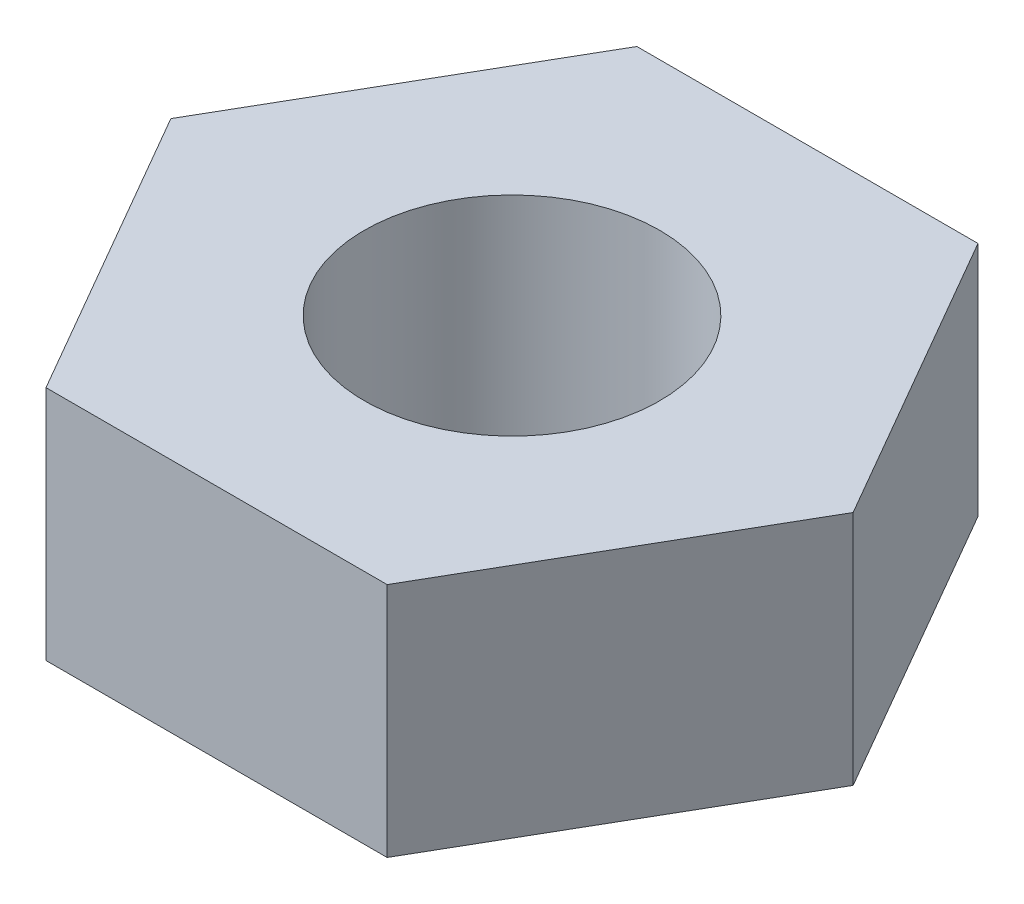
ISO-10303-21;
HEADER;
FILE_DESCRIPTION(('STEP AP214'),'2;1');
FILE_NAME('part.step','',(''),(''),'','','');
FILE_SCHEMA(('AUTOMOTIVE_DESIGN { 1 0 10303 214 1 1 1 1 }'));
ENDSEC;
DATA;
#1=APPLICATION_CONTEXT('core data for automotive mechanical design processes');
#2=APPLICATION_PROTOCOL_DEFINITION('international standard','automotive_design',2000,#1);
#3=PRODUCT_CONTEXT('',#1,'mechanical');
#4=PRODUCT('Part','Part','',(#3));
#5=PRODUCT_RELATED_PRODUCT_CATEGORY('part','',(#4));
#6=PRODUCT_DEFINITION_FORMATION('','',#4);
#7=PRODUCT_DEFINITION_CONTEXT('part definition',#1,'design');
#8=PRODUCT_DEFINITION('design','',#6,#7);
#9=PRODUCT_DEFINITION_SHAPE('','',#8);
#10=(LENGTH_UNIT() NAMED_UNIT(*) SI_UNIT(.MILLI.,.METRE.));
#11=(NAMED_UNIT(*) PLANE_ANGLE_UNIT() SI_UNIT($,.RADIAN.));
#12=(NAMED_UNIT(*) SI_UNIT($,.STERADIAN.) SOLID_ANGLE_UNIT());
#13=UNCERTAINTY_MEASURE_WITH_UNIT(LENGTH_MEASURE(1.E-05),#10,'distance_accuracy_value','');
#14=(GEOMETRIC_REPRESENTATION_CONTEXT(3) GLOBAL_UNCERTAINTY_ASSIGNED_CONTEXT((#13)) GLOBAL_UNIT_ASSIGNED_CONTEXT((#10,
#11,#12)) REPRESENTATION_CONTEXT('',''));
#15=CARTESIAN_POINT('',(0.,0.,0.));
#16=DIRECTION('',(0.,0.,1.));
#17=DIRECTION('',(1.,0.,0.));
#18=AXIS2_PLACEMENT_3D('',#15,#16,#17);
#19=CARTESIAN_POINT('',(1.15470053837925,1.6,2.));
#20=DIRECTION('',(-0.866025403784439,0.,-0.5));
#21=DIRECTION('',(-0.5,0.,0.866025403784439));
#22=AXIS2_PLACEMENT_3D('',#19,#20,#21);
#23=PLANE('',#22);
#24=DIRECTION('',(0.5,0.,-0.866025403784439));
#25=VECTOR('',#24,1.);
#26=CARTESIAN_POINT('',(1.15470053837925,0.,2.));
#27=LINE('',#26,#25);
#28=CARTESIAN_POINT('',(1.15470053837925,0.,2.));
#29=VERTEX_POINT('',#28);
#30=CARTESIAN_POINT('',(2.3094010767585,0.,0.));
#31=VERTEX_POINT('',#30);
#32=EDGE_CURVE('E125',#29,#31,#27,.T.);
#33=ORIENTED_EDGE('',*,*,#32,.T.);
#34=DIRECTION('',(0.,-1.,0.));
#35=VECTOR('',#34,1.);
#36=CARTESIAN_POINT('',(2.3094010767585,1.6,0.));
#37=LINE('',#36,#35);
#38=CARTESIAN_POINT('',(2.3094010767585,1.6,0.));
#39=VERTEX_POINT('',#38);
#40=EDGE_CURVE('E11',#39,#31,#37,.T.);
#41=ORIENTED_EDGE('',*,*,#40,.F.);
#42=DIRECTION('',(0.5,0.,-0.866025403784439));
#43=VECTOR('',#42,1.);
#44=CARTESIAN_POINT('',(1.15470053837925,1.6,2.));
#45=LINE('',#44,#43);
#46=CARTESIAN_POINT('',(1.15470053837925,1.6,2.));
#47=VERTEX_POINT('',#46);
#48=EDGE_CURVE('E136',#47,#39,#45,.T.);
#49=ORIENTED_EDGE('',*,*,#48,.F.);
#50=DIRECTION('',(0.,-1.,0.));
#51=VECTOR('',#50,1.);
#52=CARTESIAN_POINT('',(1.15470053837925,1.6,2.));
#53=LINE('',#52,#51);
#54=EDGE_CURVE('E121',#47,#29,#53,.T.);
#55=ORIENTED_EDGE('',*,*,#54,.T.);
#56=EDGE_LOOP('',(#33,#41,#49,#55));
#57=FACE_BOUND('',#56,.T.);
#58=ADVANCED_FACE('F41',(#57),#23,.F.);
#59=CARTESIAN_POINT('',(2.3094010767585,1.6,0.));
#60=DIRECTION('',(-0.866025403784438,0.,0.5));
#61=DIRECTION('',(0.5,0.,0.866025403784439));
#62=AXIS2_PLACEMENT_3D('',#59,#60,#61);
#63=PLANE('',#62);
#64=DIRECTION('',(-0.5,0.,-0.866025403784438));
#65=VECTOR('',#64,1.);
#66=CARTESIAN_POINT('',(2.3094010767585,0.,0.));
#67=LINE('',#66,#65);
#68=CARTESIAN_POINT('',(1.15470053837925,0.,-2.));
#69=VERTEX_POINT('',#68);
#70=EDGE_CURVE('E128',#31,#69,#67,.T.);
#71=ORIENTED_EDGE('',*,*,#70,.T.);
#72=DIRECTION('',(0.,-1.,0.));
#73=VECTOR('',#72,1.);
#74=CARTESIAN_POINT('',(1.15470053837925,1.6,-2.));
#75=LINE('',#74,#73);
#76=CARTESIAN_POINT('',(1.15470053837925,1.6,-2.));
#77=VERTEX_POINT('',#76);
#78=EDGE_CURVE('E49',#77,#69,#75,.T.);
#79=ORIENTED_EDGE('',*,*,#78,.F.);
#80=DIRECTION('',(-0.5,0.,-0.866025403784438));
#81=VECTOR('',#80,1.);
#82=CARTESIAN_POINT('',(2.3094010767585,1.6,0.));
#83=LINE('',#82,#81);
#84=EDGE_CURVE('E94',#39,#77,#83,.T.);
#85=ORIENTED_EDGE('',*,*,#84,.F.);
#86=ORIENTED_EDGE('',*,*,#40,.T.);
#87=EDGE_LOOP('',(#71,#79,#85,#86));
#88=FACE_BOUND('',#87,.T.);
#89=ADVANCED_FACE('F161',(#88),#63,.F.);
#90=CARTESIAN_POINT('',(1.15470053837925,1.6,-2.));
#91=DIRECTION('',(0.,0.,1.));
#92=DIRECTION('',(1.,0.,0.));
#93=AXIS2_PLACEMENT_3D('',#90,#91,#92);
#94=PLANE('',#93);
#95=DIRECTION('',(-1.,0.,0.));
#96=VECTOR('',#95,1.);
#97=CARTESIAN_POINT('',(1.15470053837925,0.,-2.));
#98=LINE('',#97,#96);
#99=CARTESIAN_POINT('',(-1.15470053837925,0.,-2.));
#100=VERTEX_POINT('',#99);
#101=EDGE_CURVE('E131',#69,#100,#98,.T.);
#102=ORIENTED_EDGE('',*,*,#101,.T.);
#103=DIRECTION('',(0.,-1.,0.));
#104=VECTOR('',#103,1.);
#105=CARTESIAN_POINT('',(-1.15470053837925,1.6,-2.));
#106=LINE('',#105,#104);
#107=CARTESIAN_POINT('',(-1.15470053837925,1.6,-2.));
#108=VERTEX_POINT('',#107);
#109=EDGE_CURVE('E116',#108,#100,#106,.T.);
#110=ORIENTED_EDGE('',*,*,#109,.F.);
#111=DIRECTION('',(-1.,0.,0.));
#112=VECTOR('',#111,1.);
#113=CARTESIAN_POINT('',(1.15470053837925,1.6,-2.));
#114=LINE('',#113,#112);
#115=EDGE_CURVE('E107',#77,#108,#114,.T.);
#116=ORIENTED_EDGE('',*,*,#115,.F.);
#117=ORIENTED_EDGE('',*,*,#78,.T.);
#118=EDGE_LOOP('',(#102,#110,#116,#117));
#119=FACE_BOUND('',#118,.T.);
#120=ADVANCED_FACE('F142',(#119),#94,.F.);
#121=CARTESIAN_POINT('',(-1.15470053837925,1.6,-2.));
#122=DIRECTION('',(0.866025403784439,0.,0.5));
#123=DIRECTION('',(0.5,0.,-0.866025403784439));
#124=AXIS2_PLACEMENT_3D('',#121,#122,#123);
#125=PLANE('',#124);
#126=DIRECTION('',(-0.5,0.,0.866025403784439));
#127=VECTOR('',#126,1.);
#128=CARTESIAN_POINT('',(-1.15470053837925,0.,-2.));
#129=LINE('',#128,#127);
#130=CARTESIAN_POINT('',(-2.3094010767585,0.,0.));
#131=VERTEX_POINT('',#130);
#132=EDGE_CURVE('E115',#100,#131,#129,.T.);
#133=ORIENTED_EDGE('',*,*,#132,.T.);
#134=DIRECTION('',(0.,-1.,0.));
#135=VECTOR('',#134,1.);
#136=CARTESIAN_POINT('',(-2.3094010767585,1.6,0.));
#137=LINE('',#136,#135);
#138=CARTESIAN_POINT('',(-2.3094010767585,1.6,0.));
#139=VERTEX_POINT('',#138);
#140=EDGE_CURVE('E112',#139,#131,#137,.T.);
#141=ORIENTED_EDGE('',*,*,#140,.F.);
#142=DIRECTION('',(-0.5,0.,0.866025403784439));
#143=VECTOR('',#142,1.);
#144=CARTESIAN_POINT('',(-1.15470053837925,1.6,-2.));
#145=LINE('',#144,#143);
#146=EDGE_CURVE('E101',#108,#139,#145,.T.);
#147=ORIENTED_EDGE('',*,*,#146,.F.);
#148=ORIENTED_EDGE('',*,*,#109,.T.);
#149=EDGE_LOOP('',(#133,#141,#147,#148));
#150=FACE_BOUND('',#149,.T.);
#151=ADVANCED_FACE('F113',(#150),#125,.F.);
#152=CARTESIAN_POINT('',(-2.3094010767585,1.6,0.));
#153=DIRECTION('',(0.866025403784438,0.,-0.5));
#154=DIRECTION('',(-0.5,0.,-0.866025403784439));
#155=AXIS2_PLACEMENT_3D('',#152,#153,#154);
#156=PLANE('',#155);
#157=DIRECTION('',(0.5,0.,0.866025403784438));
#158=VECTOR('',#157,1.);
#159=CARTESIAN_POINT('',(-2.3094010767585,0.,0.));
#160=LINE('',#159,#158);
#161=CARTESIAN_POINT('',(-1.15470053837925,0.,2.));
#162=VERTEX_POINT('',#161);
#163=EDGE_CURVE('E80',#131,#162,#160,.T.);
#164=ORIENTED_EDGE('',*,*,#163,.T.);
#165=DIRECTION('',(0.,-1.,0.));
#166=VECTOR('',#165,1.);
#167=CARTESIAN_POINT('',(-1.15470053837925,1.6,2.));
#168=LINE('',#167,#166);
#169=CARTESIAN_POINT('',(-1.15470053837925,1.6,2.));
#170=VERTEX_POINT('',#169);
#171=EDGE_CURVE('E117',#170,#162,#168,.T.);
#172=ORIENTED_EDGE('',*,*,#171,.F.);
#173=DIRECTION('',(0.5,0.,0.866025403784438));
#174=VECTOR('',#173,1.);
#175=CARTESIAN_POINT('',(-2.3094010767585,1.6,0.));
#176=LINE('',#175,#174);
#177=EDGE_CURVE('E105',#139,#170,#176,.T.);
#178=ORIENTED_EDGE('',*,*,#177,.F.);
#179=ORIENTED_EDGE('',*,*,#140,.T.);
#180=EDGE_LOOP('',(#164,#172,#178,#179));
#181=FACE_BOUND('',#180,.T.);
#182=ADVANCED_FACE('F119',(#181),#156,.F.);
#183=CARTESIAN_POINT('',(-1.15470053837925,1.6,2.));
#184=DIRECTION('',(0.,0.,-1.));
#185=DIRECTION('',(-1.,0.,0.));
#186=AXIS2_PLACEMENT_3D('',#183,#184,#185);
#187=PLANE('',#186);
#188=DIRECTION('',(1.,0.,0.));
#189=VECTOR('',#188,1.);
#190=CARTESIAN_POINT('',(-1.15470053837925,0.,2.));
#191=LINE('',#190,#189);
#192=EDGE_CURVE('E86',#162,#29,#191,.T.);
#193=ORIENTED_EDGE('',*,*,#192,.T.);
#194=ORIENTED_EDGE('',*,*,#54,.F.);
#195=DIRECTION('',(1.,0.,0.));
#196=VECTOR('',#195,1.);
#197=CARTESIAN_POINT('',(-1.15470053837925,1.6,2.));
#198=LINE('',#197,#196);
#199=EDGE_CURVE('E57',#170,#47,#198,.T.);
#200=ORIENTED_EDGE('',*,*,#199,.F.);
#201=ORIENTED_EDGE('',*,*,#171,.T.);
#202=EDGE_LOOP('',(#193,#194,#200,#201));
#203=FACE_BOUND('',#202,.T.);
#204=ADVANCED_FACE('F149',(#203),#187,.F.);
#205=CARTESIAN_POINT('',(0.,1.6,0.));
#206=DIRECTION('',(0.,1.,0.));
#207=DIRECTION('',(0.,0.,1.));
#208=AXIS2_PLACEMENT_3D('',#205,#206,#207);
#209=PLANE('',#208);
#210=CARTESIAN_POINT('',(0.,1.6,0.));
#211=DIRECTION('',(0.,-1.,0.));
#212=DIRECTION('',(0.,0.,-1.));
#213=AXIS2_PLACEMENT_3D('',#210,#211,#212);
#214=CIRCLE('',#213,1.);
#215=CARTESIAN_POINT('',(0.,1.6,-1.));
#216=VERTEX_POINT('',#215);
#217=EDGE_CURVE('E129',#216,#216,#214,.T.);
#218=ORIENTED_EDGE('',*,*,#217,.T.);
#219=EDGE_LOOP('',(#218));
#220=FACE_BOUND('',#219,.T.);
#221=ORIENTED_EDGE('',*,*,#48,.T.);
#222=ORIENTED_EDGE('',*,*,#84,.T.);
#223=ORIENTED_EDGE('',*,*,#115,.T.);
#224=ORIENTED_EDGE('',*,*,#146,.T.);
#225=ORIENTED_EDGE('',*,*,#177,.T.);
#226=ORIENTED_EDGE('',*,*,#199,.T.);
#227=EDGE_LOOP('',(#221,#222,#223,#224,#225,#226));
#228=FACE_BOUND('',#227,.T.);
#229=ADVANCED_FACE('F103',(#220,#228),#209,.T.);
#230=CARTESIAN_POINT('',(0.,0.,0.));
#231=DIRECTION('',(0.,1.,0.));
#232=DIRECTION('',(0.,0.,1.));
#233=AXIS2_PLACEMENT_3D('',#230,#231,#232);
#234=PLANE('',#233);
#235=CARTESIAN_POINT('',(0.,0.,0.));
#236=DIRECTION('',(0.,-1.,0.));
#237=DIRECTION('',(0.,0.,-1.));
#238=AXIS2_PLACEMENT_3D('',#235,#236,#237);
#239=CIRCLE('',#238,1.);
#240=CARTESIAN_POINT('',(0.,0.,-1.));
#241=VERTEX_POINT('',#240);
#242=EDGE_CURVE('E248',#241,#241,#239,.T.);
#243=ORIENTED_EDGE('',*,*,#242,.F.);
#244=EDGE_LOOP('',(#243));
#245=FACE_BOUND('',#244,.T.);
#246=ORIENTED_EDGE('',*,*,#32,.F.);
#247=ORIENTED_EDGE('',*,*,#192,.F.);
#248=ORIENTED_EDGE('',*,*,#163,.F.);
#249=ORIENTED_EDGE('',*,*,#132,.F.);
#250=ORIENTED_EDGE('',*,*,#101,.F.);
#251=ORIENTED_EDGE('',*,*,#70,.F.);
#252=EDGE_LOOP('',(#246,#247,#248,#249,#250,#251));
#253=FACE_BOUND('',#252,.T.);
#254=ADVANCED_FACE('F145',(#245,#253),#234,.F.);
#255=CARTESIAN_POINT('',(0.,1.6,0.));
#256=DIRECTION('',(0.,-1.,0.));
#257=DIRECTION('',(0.,0.,-1.));
#258=AXIS2_PLACEMENT_3D('',#255,#256,#257);
#259=CYLINDRICAL_SURFACE('',#258,1.);
#260=ORIENTED_EDGE('',*,*,#217,.F.);
#261=EDGE_LOOP('',(#260));
#262=FACE_BOUND('',#261,.T.);
#263=ORIENTED_EDGE('',*,*,#242,.T.);
#264=EDGE_LOOP('',(#263));
#265=FACE_BOUND('',#264,.T.);
#266=ADVANCED_FACE('F201',(#262,#265),#259,.F.);
#267=CLOSED_SHELL('',(#58,#89,#120,#151,#182,#204,#229,#254,#266));
#268=MANIFOLD_SOLID_BREP('B2',#267);
#269=ADVANCED_BREP_SHAPE_REPRESENTATION('',(#18,#268),#14);
#270=SHAPE_DEFINITION_REPRESENTATION(#9,#269);
ENDSEC;
END-ISO-10303-21;
